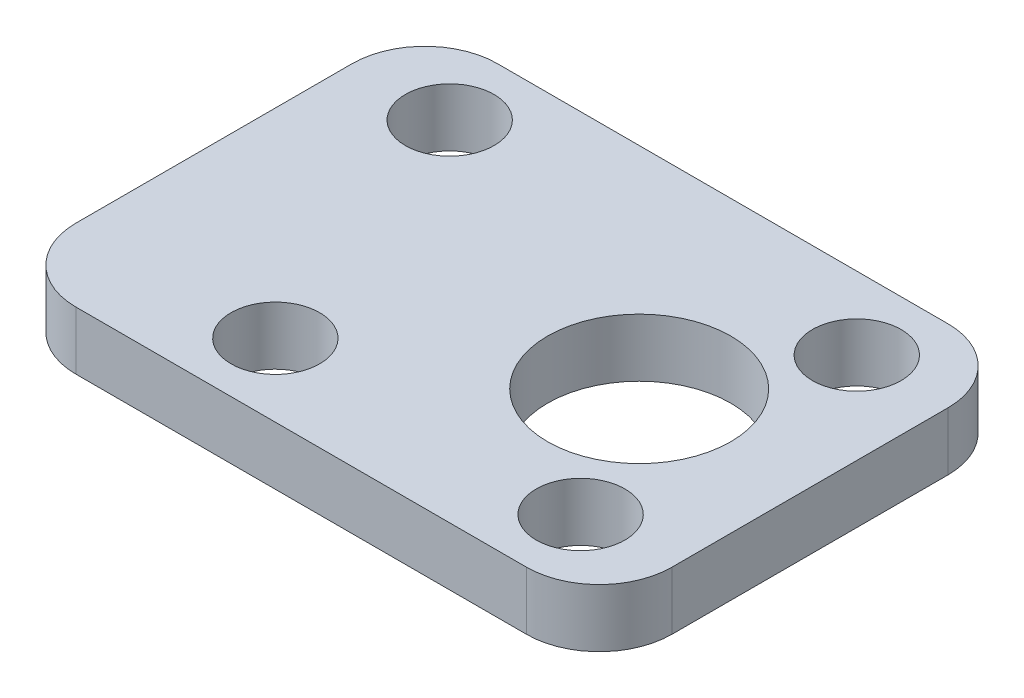
ISO-10303-21;
HEADER;
FILE_DESCRIPTION(('STEP AP214'),'2;1');
FILE_NAME('part.step','',(''),(''),'','','');
FILE_SCHEMA(('AUTOMOTIVE_DESIGN { 1 0 10303 214 1 1 1 1 }'));
ENDSEC;
DATA;
#1=APPLICATION_CONTEXT('core data for automotive mechanical design processes');
#2=APPLICATION_PROTOCOL_DEFINITION('international standard','automotive_design',2000,#1);
#3=PRODUCT_CONTEXT('',#1,'mechanical');
#4=PRODUCT('Part','Part','',(#3));
#5=PRODUCT_RELATED_PRODUCT_CATEGORY('part','',(#4));
#6=PRODUCT_DEFINITION_FORMATION('','',#4);
#7=PRODUCT_DEFINITION_CONTEXT('part definition',#1,'design');
#8=PRODUCT_DEFINITION('design','',#6,#7);
#9=PRODUCT_DEFINITION_SHAPE('','',#8);
#10=(LENGTH_UNIT() NAMED_UNIT(*) SI_UNIT(.MILLI.,.METRE.));
#11=(NAMED_UNIT(*) PLANE_ANGLE_UNIT() SI_UNIT($,.RADIAN.));
#12=(NAMED_UNIT(*) SI_UNIT($,.STERADIAN.) SOLID_ANGLE_UNIT());
#13=UNCERTAINTY_MEASURE_WITH_UNIT(LENGTH_MEASURE(1.E-05),#10,'distance_accuracy_value','');
#14=(GEOMETRIC_REPRESENTATION_CONTEXT(3) GLOBAL_UNCERTAINTY_ASSIGNED_CONTEXT((#13)) GLOBAL_UNIT_ASSIGNED_CONTEXT((#10,
#11,#12)) REPRESENTATION_CONTEXT('',''));
#15=CARTESIAN_POINT('',(0.,0.,0.));
#16=DIRECTION('',(0.,0.,1.));
#17=DIRECTION('',(1.,0.,0.));
#18=AXIS2_PLACEMENT_3D('',#15,#16,#17);
#19=CARTESIAN_POINT('',(0.,8.,0.));
#20=DIRECTION('',(0.,1.,0.));
#21=DIRECTION('',(0.,0.,1.));
#22=AXIS2_PLACEMENT_3D('',#19,#20,#21);
#23=PLANE('',#22);
#24=DIRECTION('',(0.,0.,-1.));
#25=VECTOR('',#24,1.);
#26=CARTESIAN_POINT('',(82.,8.,0.));
#27=LINE('',#26,#25);
#28=CARTESIAN_POINT('',(82.,8.,-10.));
#29=VERTEX_POINT('',#28);
#30=CARTESIAN_POINT('',(82.,8.,-48.));
#31=VERTEX_POINT('',#30);
#32=EDGE_CURVE('E114',#29,#31,#27,.T.);
#33=ORIENTED_EDGE('',*,*,#32,.F.);
#34=CARTESIAN_POINT('',(92.,8.,-10.));
#35=DIRECTION('',(0.,1.,0.));
#36=DIRECTION('',(0.,0.,1.));
#37=AXIS2_PLACEMENT_3D('',#34,#35,#36);
#38=CIRCLE('',#37,10.);
#39=CARTESIAN_POINT('',(92.,8.,0.));
#40=VERTEX_POINT('',#39);
#41=EDGE_CURVE('E127',#29,#40,#38,.T.);
#42=ORIENTED_EDGE('',*,*,#41,.T.);
#43=DIRECTION('',(-1.,0.,0.));
#44=VECTOR('',#43,1.);
#45=CARTESIAN_POINT('',(164.,8.,0.));
#46=LINE('',#45,#44);
#47=CARTESIAN_POINT('',(154.,8.,0.));
#48=VERTEX_POINT('',#47);
#49=EDGE_CURVE('E206',#48,#40,#46,.T.);
#50=ORIENTED_EDGE('',*,*,#49,.F.);
#51=CARTESIAN_POINT('',(154.,8.,-10.));
#52=DIRECTION('',(0.,1.,0.));
#53=DIRECTION('',(0.,0.,1.));
#54=AXIS2_PLACEMENT_3D('',#51,#52,#53);
#55=CIRCLE('',#54,10.);
#56=CARTESIAN_POINT('',(164.,8.,-10.));
#57=VERTEX_POINT('',#56);
#58=EDGE_CURVE('E140',#48,#57,#55,.T.);
#59=ORIENTED_EDGE('',*,*,#58,.T.);
#60=DIRECTION('',(0.,0.,-1.));
#61=VECTOR('',#60,1.);
#62=CARTESIAN_POINT('',(164.,8.,0.));
#63=LINE('',#62,#61);
#64=CARTESIAN_POINT('',(164.,8.,-48.));
#65=VERTEX_POINT('',#64);
#66=EDGE_CURVE('E160',#57,#65,#63,.T.);
#67=ORIENTED_EDGE('',*,*,#66,.T.);
#68=CARTESIAN_POINT('',(154.,8.,-48.));
#69=DIRECTION('',(0.,1.,0.));
#70=DIRECTION('',(0.,0.,1.));
#71=AXIS2_PLACEMENT_3D('',#68,#69,#70);
#72=CIRCLE('',#71,10.);
#73=CARTESIAN_POINT('',(154.,8.,-58.));
#74=VERTEX_POINT('',#73);
#75=EDGE_CURVE('E67',#65,#74,#72,.T.);
#76=ORIENTED_EDGE('',*,*,#75,.T.);
#77=DIRECTION('',(-1.,0.,0.));
#78=VECTOR('',#77,1.);
#79=CARTESIAN_POINT('',(164.,8.,-58.));
#80=LINE('',#79,#78);
#81=CARTESIAN_POINT('',(92.,8.,-58.));
#82=VERTEX_POINT('',#81);
#83=EDGE_CURVE('E184',#74,#82,#80,.T.);
#84=ORIENTED_EDGE('',*,*,#83,.T.);
#85=CARTESIAN_POINT('',(92.,8.,-48.));
#86=DIRECTION('',(0.,1.,0.));
#87=DIRECTION('',(0.,0.,1.));
#88=AXIS2_PLACEMENT_3D('',#85,#86,#87);
#89=CIRCLE('',#88,10.);
#90=EDGE_CURVE('E130',#82,#31,#89,.T.);
#91=ORIENTED_EDGE('',*,*,#90,.T.);
#92=EDGE_LOOP('',(#33,#42,#50,#59,#67,#76,#84,#91));
#93=FACE_BOUND('',#92,.T.);
#94=CARTESIAN_POINT('',(140.5,8.,-29.));
#95=DIRECTION('',(0.,-1.,0.));
#96=DIRECTION('',(0.,0.,1.));
#97=AXIS2_PLACEMENT_3D('',#94,#95,#96);
#98=CIRCLE('',#97,12.6);
#99=CARTESIAN_POINT('',(140.5,8.,-16.4));
#100=VERTEX_POINT('',#99);
#101=EDGE_CURVE('E177',#100,#100,#98,.T.);
#102=ORIENTED_EDGE('',*,*,#101,.T.);
#103=EDGE_LOOP('',(#102));
#104=FACE_BOUND('',#103,.T.);
#105=CARTESIAN_POINT('',(95.43,8.,-48.));
#106=DIRECTION('',(0.,-1.,0.));
#107=DIRECTION('',(0.,0.,1.));
#108=AXIS2_PLACEMENT_3D('',#105,#106,#107);
#109=CIRCLE('',#108,6.1);
#110=CARTESIAN_POINT('',(95.43,8.,-41.9));
#111=VERTEX_POINT('',#110);
#112=EDGE_CURVE('E221',#111,#111,#109,.T.);
#113=ORIENTED_EDGE('',*,*,#112,.T.);
#114=EDGE_LOOP('',(#113));
#115=FACE_BOUND('',#114,.T.);
#116=CARTESIAN_POINT('',(109.438925726122,8.,-10.));
#117=DIRECTION('',(0.,-1.,0.));
#118=DIRECTION('',(0.,0.,1.));
#119=AXIS2_PLACEMENT_3D('',#116,#117,#118);
#120=CIRCLE('',#119,6.1);
#121=CARTESIAN_POINT('',(109.438925726122,8.,-3.9));
#122=VERTEX_POINT('',#121);
#123=EDGE_CURVE('E217',#122,#122,#120,.T.);
#124=ORIENTED_EDGE('',*,*,#123,.T.);
#125=EDGE_LOOP('',(#124));
#126=FACE_BOUND('',#125,.T.);
#127=CARTESIAN_POINT('',(151.438925726122,8.,-10.));
#128=DIRECTION('',(0.,-1.,0.));
#129=DIRECTION('',(0.,0.,1.));
#130=AXIS2_PLACEMENT_3D('',#127,#128,#129);
#131=CIRCLE('',#130,6.1);
#132=CARTESIAN_POINT('',(151.438925726122,8.,-3.9));
#133=VERTEX_POINT('',#132);
#134=EDGE_CURVE('E213',#133,#133,#131,.T.);
#135=ORIENTED_EDGE('',*,*,#134,.T.);
#136=EDGE_LOOP('',(#135));
#137=FACE_BOUND('',#136,.T.);
#138=CARTESIAN_POINT('',(151.438925726122,8.,-48.));
#139=DIRECTION('',(0.,-1.,0.));
#140=DIRECTION('',(0.,0.,1.));
#141=AXIS2_PLACEMENT_3D('',#138,#139,#140);
#142=CIRCLE('',#141,6.1);
#143=CARTESIAN_POINT('',(151.438925726122,8.,-41.9));
#144=VERTEX_POINT('',#143);
#145=EDGE_CURVE('E209',#144,#144,#142,.T.);
#146=ORIENTED_EDGE('',*,*,#145,.T.);
#147=EDGE_LOOP('',(#146));
#148=FACE_BOUND('',#147,.T.);
#149=ADVANCED_FACE('F45',(#93,#104,#115,#126,#137,#148),#23,.T.);
#150=CARTESIAN_POINT('',(0.,0.,0.));
#151=DIRECTION('',(0.,1.,0.));
#152=DIRECTION('',(0.,0.,1.));
#153=AXIS2_PLACEMENT_3D('',#150,#151,#152);
#154=PLANE('',#153);
#155=CARTESIAN_POINT('',(92.,0.,-10.));
#156=DIRECTION('',(0.,1.,0.));
#157=DIRECTION('',(0.,0.,1.));
#158=AXIS2_PLACEMENT_3D('',#155,#156,#157);
#159=CIRCLE('',#158,10.);
#160=CARTESIAN_POINT('',(92.,0.,0.));
#161=VERTEX_POINT('',#160);
#162=CARTESIAN_POINT('',(82.,0.,-10.));
#163=VERTEX_POINT('',#162);
#164=EDGE_CURVE('E197',#161,#163,#159,.F.);
#165=ORIENTED_EDGE('',*,*,#164,.T.);
#166=DIRECTION('',(0.,0.,-1.));
#167=VECTOR('',#166,1.);
#168=CARTESIAN_POINT('',(82.,0.,0.));
#169=LINE('',#168,#167);
#170=CARTESIAN_POINT('',(82.,0.,-48.));
#171=VERTEX_POINT('',#170);
#172=EDGE_CURVE('E117',#163,#171,#169,.T.);
#173=ORIENTED_EDGE('',*,*,#172,.T.);
#174=CARTESIAN_POINT('',(92.,0.,-48.));
#175=DIRECTION('',(0.,1.,0.));
#176=DIRECTION('',(0.,0.,1.));
#177=AXIS2_PLACEMENT_3D('',#174,#175,#176);
#178=CIRCLE('',#177,10.);
#179=CARTESIAN_POINT('',(92.,0.,-58.));
#180=VERTEX_POINT('',#179);
#181=EDGE_CURVE('E190',#171,#180,#178,.F.);
#182=ORIENTED_EDGE('',*,*,#181,.T.);
#183=DIRECTION('',(-1.,0.,0.));
#184=VECTOR('',#183,1.);
#185=CARTESIAN_POINT('',(164.,0.,-58.));
#186=LINE('',#185,#184);
#187=CARTESIAN_POINT('',(154.,0.,-58.));
#188=VERTEX_POINT('',#187);
#189=EDGE_CURVE('E172',#188,#180,#186,.T.);
#190=ORIENTED_EDGE('',*,*,#189,.F.);
#191=CARTESIAN_POINT('',(154.,0.,-48.));
#192=DIRECTION('',(0.,1.,0.));
#193=DIRECTION('',(0.,0.,1.));
#194=AXIS2_PLACEMENT_3D('',#191,#192,#193);
#195=CIRCLE('',#194,10.);
#196=CARTESIAN_POINT('',(164.,0.,-48.));
#197=VERTEX_POINT('',#196);
#198=EDGE_CURVE('E170',#188,#197,#195,.F.);
#199=ORIENTED_EDGE('',*,*,#198,.T.);
#200=DIRECTION('',(0.,0.,-1.));
#201=VECTOR('',#200,1.);
#202=CARTESIAN_POINT('',(164.,0.,0.));
#203=LINE('',#202,#201);
#204=CARTESIAN_POINT('',(164.,0.,-10.));
#205=VERTEX_POINT('',#204);
#206=EDGE_CURVE('E158',#205,#197,#203,.T.);
#207=ORIENTED_EDGE('',*,*,#206,.F.);
#208=CARTESIAN_POINT('',(154.,0.,-10.));
#209=DIRECTION('',(0.,1.,0.));
#210=DIRECTION('',(0.,0.,1.));
#211=AXIS2_PLACEMENT_3D('',#208,#209,#210);
#212=CIRCLE('',#211,10.);
#213=CARTESIAN_POINT('',(154.,0.,0.));
#214=VERTEX_POINT('',#213);
#215=EDGE_CURVE('E167',#205,#214,#212,.F.);
#216=ORIENTED_EDGE('',*,*,#215,.T.);
#217=DIRECTION('',(-1.,0.,0.));
#218=VECTOR('',#217,1.);
#219=CARTESIAN_POINT('',(164.,0.,0.));
#220=LINE('',#219,#218);
#221=EDGE_CURVE('E173',#214,#161,#220,.T.);
#222=ORIENTED_EDGE('',*,*,#221,.T.);
#223=EDGE_LOOP('',(#165,#173,#182,#190,#199,#207,#216,#222));
#224=FACE_BOUND('',#223,.T.);
#225=CARTESIAN_POINT('',(140.5,0.,-29.));
#226=DIRECTION('',(0.,-1.,0.));
#227=DIRECTION('',(0.,0.,1.));
#228=AXIS2_PLACEMENT_3D('',#225,#226,#227);
#229=CIRCLE('',#228,12.6);
#230=CARTESIAN_POINT('',(140.5,0.,-16.4));
#231=VERTEX_POINT('',#230);
#232=EDGE_CURVE('E231',#231,#231,#229,.T.);
#233=ORIENTED_EDGE('',*,*,#232,.F.);
#234=EDGE_LOOP('',(#233));
#235=FACE_BOUND('',#234,.T.);
#236=CARTESIAN_POINT('',(95.43,0.,-48.));
#237=DIRECTION('',(0.,-1.,0.));
#238=DIRECTION('',(0.,0.,1.));
#239=AXIS2_PLACEMENT_3D('',#236,#237,#238);
#240=CIRCLE('',#239,6.1);
#241=CARTESIAN_POINT('',(95.43,0.,-41.9));
#242=VERTEX_POINT('',#241);
#243=EDGE_CURVE('E235',#242,#242,#240,.T.);
#244=ORIENTED_EDGE('',*,*,#243,.F.);
#245=EDGE_LOOP('',(#244));
#246=FACE_BOUND('',#245,.T.);
#247=CARTESIAN_POINT('',(109.438925726122,0.,-10.));
#248=DIRECTION('',(0.,-1.,0.));
#249=DIRECTION('',(0.,0.,1.));
#250=AXIS2_PLACEMENT_3D('',#247,#248,#249);
#251=CIRCLE('',#250,6.1);
#252=CARTESIAN_POINT('',(109.438925726122,0.,-3.9));
#253=VERTEX_POINT('',#252);
#254=EDGE_CURVE('E239',#253,#253,#251,.T.);
#255=ORIENTED_EDGE('',*,*,#254,.F.);
#256=EDGE_LOOP('',(#255));
#257=FACE_BOUND('',#256,.T.);
#258=CARTESIAN_POINT('',(151.438925726122,0.,-10.));
#259=DIRECTION('',(0.,-1.,0.));
#260=DIRECTION('',(0.,0.,1.));
#261=AXIS2_PLACEMENT_3D('',#258,#259,#260);
#262=CIRCLE('',#261,6.1);
#263=CARTESIAN_POINT('',(151.438925726122,0.,-3.9));
#264=VERTEX_POINT('',#263);
#265=EDGE_CURVE('E243',#264,#264,#262,.T.);
#266=ORIENTED_EDGE('',*,*,#265,.F.);
#267=EDGE_LOOP('',(#266));
#268=FACE_BOUND('',#267,.T.);
#269=CARTESIAN_POINT('',(151.438925726122,0.,-48.));
#270=DIRECTION('',(0.,-1.,0.));
#271=DIRECTION('',(0.,0.,1.));
#272=AXIS2_PLACEMENT_3D('',#269,#270,#271);
#273=CIRCLE('',#272,6.1);
#274=CARTESIAN_POINT('',(151.438925726122,0.,-41.9));
#275=VERTEX_POINT('',#274);
#276=EDGE_CURVE('E179',#275,#275,#273,.T.);
#277=ORIENTED_EDGE('',*,*,#276,.F.);
#278=EDGE_LOOP('',(#277));
#279=FACE_BOUND('',#278,.T.);
#280=ADVANCED_FACE('F164',(#224,#235,#246,#257,#268,#279),#154,.F.);
#281=CARTESIAN_POINT('',(164.,8.,0.));
#282=DIRECTION('',(0.,0.,1.));
#283=DIRECTION('',(1.,0.,0.));
#284=AXIS2_PLACEMENT_3D('',#281,#282,#283);
#285=PLANE('',#284);
#286=ORIENTED_EDGE('',*,*,#49,.T.);
#287=DIRECTION('',(0.,-1.,0.));
#288=VECTOR('',#287,1.);
#289=CARTESIAN_POINT('',(92.,8.,0.));
#290=LINE('',#289,#288);
#291=EDGE_CURVE('E137',#40,#161,#290,.T.);
#292=ORIENTED_EDGE('',*,*,#291,.T.);
#293=ORIENTED_EDGE('',*,*,#221,.F.);
#294=DIRECTION('',(0.,-1.,0.));
#295=VECTOR('',#294,1.);
#296=CARTESIAN_POINT('',(154.,8.,0.));
#297=LINE('',#296,#295);
#298=EDGE_CURVE('E122',#214,#48,#297,.F.);
#299=ORIENTED_EDGE('',*,*,#298,.T.);
#300=EDGE_LOOP('',(#286,#292,#293,#299));
#301=FACE_BOUND('',#300,.T.);
#302=ADVANCED_FACE('F253',(#301),#285,.T.);
#303=CARTESIAN_POINT('',(164.,8.,0.));
#304=DIRECTION('',(-1.,0.,0.));
#305=DIRECTION('',(0.,0.,1.));
#306=AXIS2_PLACEMENT_3D('',#303,#304,#305);
#307=PLANE('',#306);
#308=ORIENTED_EDGE('',*,*,#66,.F.);
#309=DIRECTION('',(0.,-1.,0.));
#310=VECTOR('',#309,1.);
#311=CARTESIAN_POINT('',(164.,0.,-10.));
#312=LINE('',#311,#310);
#313=EDGE_CURVE('E144',#57,#205,#312,.T.);
#314=ORIENTED_EDGE('',*,*,#313,.T.);
#315=ORIENTED_EDGE('',*,*,#206,.T.);
#316=DIRECTION('',(0.,-1.,0.));
#317=VECTOR('',#316,1.);
#318=CARTESIAN_POINT('',(164.,8.,-48.));
#319=LINE('',#318,#317);
#320=EDGE_CURVE('E139',#197,#65,#319,.F.);
#321=ORIENTED_EDGE('',*,*,#320,.T.);
#322=EDGE_LOOP('',(#308,#314,#315,#321));
#323=FACE_BOUND('',#322,.T.);
#324=ADVANCED_FACE('F157',(#323),#307,.F.);
#325=CARTESIAN_POINT('',(164.,8.,-58.));
#326=DIRECTION('',(0.,0.,1.));
#327=DIRECTION('',(1.,0.,0.));
#328=AXIS2_PLACEMENT_3D('',#325,#326,#327);
#329=PLANE('',#328);
#330=ORIENTED_EDGE('',*,*,#83,.F.);
#331=DIRECTION('',(0.,-1.,0.));
#332=VECTOR('',#331,1.);
#333=CARTESIAN_POINT('',(154.,8.,-58.));
#334=LINE('',#333,#332);
#335=EDGE_CURVE('E11',#74,#188,#334,.T.);
#336=ORIENTED_EDGE('',*,*,#335,.T.);
#337=ORIENTED_EDGE('',*,*,#189,.T.);
#338=DIRECTION('',(0.,-1.,0.));
#339=VECTOR('',#338,1.);
#340=CARTESIAN_POINT('',(92.,8.,-58.));
#341=LINE('',#340,#339);
#342=EDGE_CURVE('E54',#180,#82,#341,.F.);
#343=ORIENTED_EDGE('',*,*,#342,.T.);
#344=EDGE_LOOP('',(#330,#336,#337,#343));
#345=FACE_BOUND('',#344,.T.);
#346=ADVANCED_FACE('F277',(#345),#329,.F.);
#347=CARTESIAN_POINT('',(151.438925726122,8.,-48.));
#348=DIRECTION('',(0.,-1.,0.));
#349=DIRECTION('',(0.,0.,-1.));
#350=AXIS2_PLACEMENT_3D('',#347,#348,#349);
#351=CYLINDRICAL_SURFACE('',#350,6.1);
#352=ORIENTED_EDGE('',*,*,#145,.F.);
#353=EDGE_LOOP('',(#352));
#354=FACE_BOUND('',#353,.T.);
#355=ORIENTED_EDGE('',*,*,#276,.T.);
#356=EDGE_LOOP('',(#355));
#357=FACE_BOUND('',#356,.T.);
#358=ADVANCED_FACE('F250',(#354,#357),#351,.F.);
#359=CARTESIAN_POINT('',(151.438925726122,8.,-10.));
#360=DIRECTION('',(0.,-1.,0.));
#361=DIRECTION('',(0.,0.,-1.));
#362=AXIS2_PLACEMENT_3D('',#359,#360,#361);
#363=CYLINDRICAL_SURFACE('',#362,6.1);
#364=ORIENTED_EDGE('',*,*,#134,.F.);
#365=EDGE_LOOP('',(#364));
#366=FACE_BOUND('',#365,.T.);
#367=ORIENTED_EDGE('',*,*,#265,.T.);
#368=EDGE_LOOP('',(#367));
#369=FACE_BOUND('',#368,.T.);
#370=ADVANCED_FACE('F287',(#366,#369),#363,.F.);
#371=CARTESIAN_POINT('',(109.438925726122,8.,-10.));
#372=DIRECTION('',(0.,-1.,0.));
#373=DIRECTION('',(0.,0.,-1.));
#374=AXIS2_PLACEMENT_3D('',#371,#372,#373);
#375=CYLINDRICAL_SURFACE('',#374,6.1);
#376=ORIENTED_EDGE('',*,*,#123,.F.);
#377=EDGE_LOOP('',(#376));
#378=FACE_BOUND('',#377,.T.);
#379=ORIENTED_EDGE('',*,*,#254,.T.);
#380=EDGE_LOOP('',(#379));
#381=FACE_BOUND('',#380,.T.);
#382=ADVANCED_FACE('F295',(#378,#381),#375,.F.);
#383=CARTESIAN_POINT('',(95.43,8.,-48.));
#384=DIRECTION('',(0.,-1.,0.));
#385=DIRECTION('',(0.,0.,-1.));
#386=AXIS2_PLACEMENT_3D('',#383,#384,#385);
#387=CYLINDRICAL_SURFACE('',#386,6.1);
#388=ORIENTED_EDGE('',*,*,#112,.F.);
#389=EDGE_LOOP('',(#388));
#390=FACE_BOUND('',#389,.T.);
#391=ORIENTED_EDGE('',*,*,#243,.T.);
#392=EDGE_LOOP('',(#391));
#393=FACE_BOUND('',#392,.T.);
#394=ADVANCED_FACE('F299',(#390,#393),#387,.F.);
#395=CARTESIAN_POINT('',(140.5,8.,-29.));
#396=DIRECTION('',(0.,-1.,0.));
#397=DIRECTION('',(0.,0.,-1.));
#398=AXIS2_PLACEMENT_3D('',#395,#396,#397);
#399=CYLINDRICAL_SURFACE('',#398,12.6);
#400=ORIENTED_EDGE('',*,*,#101,.F.);
#401=EDGE_LOOP('',(#400));
#402=FACE_BOUND('',#401,.T.);
#403=ORIENTED_EDGE('',*,*,#232,.T.);
#404=EDGE_LOOP('',(#403));
#405=FACE_BOUND('',#404,.T.);
#406=ADVANCED_FACE('F267',(#402,#405),#399,.F.);
#407=CARTESIAN_POINT('',(92.,8.,-10.));
#408=DIRECTION('',(0.,-1.,0.));
#409=DIRECTION('',(0.,0.,-1.));
#410=AXIS2_PLACEMENT_3D('',#407,#408,#409);
#411=CYLINDRICAL_SURFACE('',#410,10.);
#412=ORIENTED_EDGE('',*,*,#41,.F.);
#413=DIRECTION('',(0.,-1.,0.));
#414=VECTOR('',#413,1.);
#415=CARTESIAN_POINT('',(82.,8.,-10.));
#416=LINE('',#415,#414);
#417=EDGE_CURVE('E111',#29,#163,#416,.T.);
#418=ORIENTED_EDGE('',*,*,#417,.T.);
#419=ORIENTED_EDGE('',*,*,#164,.F.);
#420=ORIENTED_EDGE('',*,*,#291,.F.);
#421=EDGE_LOOP('',(#412,#418,#419,#420));
#422=FACE_BOUND('',#421,.T.);
#423=ADVANCED_FACE('F135',(#422),#411,.T.);
#424=CARTESIAN_POINT('',(154.,8.,-10.));
#425=DIRECTION('',(0.,1.,0.));
#426=DIRECTION('',(0.,0.,1.));
#427=AXIS2_PLACEMENT_3D('',#424,#425,#426);
#428=CYLINDRICAL_SURFACE('',#427,10.);
#429=ORIENTED_EDGE('',*,*,#58,.F.);
#430=ORIENTED_EDGE('',*,*,#298,.F.);
#431=ORIENTED_EDGE('',*,*,#215,.F.);
#432=ORIENTED_EDGE('',*,*,#313,.F.);
#433=EDGE_LOOP('',(#429,#430,#431,#432));
#434=FACE_BOUND('',#433,.T.);
#435=ADVANCED_FACE('F266',(#434),#428,.T.);
#436=CARTESIAN_POINT('',(154.,8.,-48.));
#437=DIRECTION('',(0.,-1.,0.));
#438=DIRECTION('',(0.,0.,-1.));
#439=AXIS2_PLACEMENT_3D('',#436,#437,#438);
#440=CYLINDRICAL_SURFACE('',#439,10.);
#441=ORIENTED_EDGE('',*,*,#75,.F.);
#442=ORIENTED_EDGE('',*,*,#320,.F.);
#443=ORIENTED_EDGE('',*,*,#198,.F.);
#444=ORIENTED_EDGE('',*,*,#335,.F.);
#445=EDGE_LOOP('',(#441,#442,#443,#444));
#446=FACE_BOUND('',#445,.T.);
#447=ADVANCED_FACE('F269',(#446),#440,.T.);
#448=CARTESIAN_POINT('',(92.,8.,-48.));
#449=DIRECTION('',(0.,1.,0.));
#450=DIRECTION('',(0.,0.,1.));
#451=AXIS2_PLACEMENT_3D('',#448,#449,#450);
#452=CYLINDRICAL_SURFACE('',#451,10.);
#453=ORIENTED_EDGE('',*,*,#90,.F.);
#454=ORIENTED_EDGE('',*,*,#342,.F.);
#455=ORIENTED_EDGE('',*,*,#181,.F.);
#456=DIRECTION('',(0.,-1.,0.));
#457=VECTOR('',#456,1.);
#458=CARTESIAN_POINT('',(82.,8.,-48.));
#459=LINE('',#458,#457);
#460=EDGE_CURVE('E123',#171,#31,#459,.F.);
#461=ORIENTED_EDGE('',*,*,#460,.T.);
#462=EDGE_LOOP('',(#453,#454,#455,#461));
#463=FACE_BOUND('',#462,.T.);
#464=ADVANCED_FACE('F47',(#463),#452,.T.);
#465=CARTESIAN_POINT('',(82.,0.,0.));
#466=DIRECTION('',(1.,0.,0.));
#467=DIRECTION('',(0.,0.,-1.));
#468=AXIS2_PLACEMENT_3D('',#465,#466,#467);
#469=PLANE('',#468);
#470=ORIENTED_EDGE('',*,*,#417,.F.);
#471=ORIENTED_EDGE('',*,*,#32,.T.);
#472=ORIENTED_EDGE('',*,*,#460,.F.);
#473=ORIENTED_EDGE('',*,*,#172,.F.);
#474=EDGE_LOOP('',(#470,#471,#472,#473));
#475=FACE_BOUND('',#474,.T.);
#476=ADVANCED_FACE('F113',(#475),#469,.F.);
#477=CLOSED_SHELL('',(#149,#280,#302,#324,#346,#358,#370,#382,#394,#406,#423,#435,#447,#464,#476));
#478=MANIFOLD_SOLID_BREP('B2',#477);
#479=ADVANCED_BREP_SHAPE_REPRESENTATION('',(#18,#478),#14);
#480=SHAPE_DEFINITION_REPRESENTATION(#9,#479);
ENDSEC;
END-ISO-10303-21;
